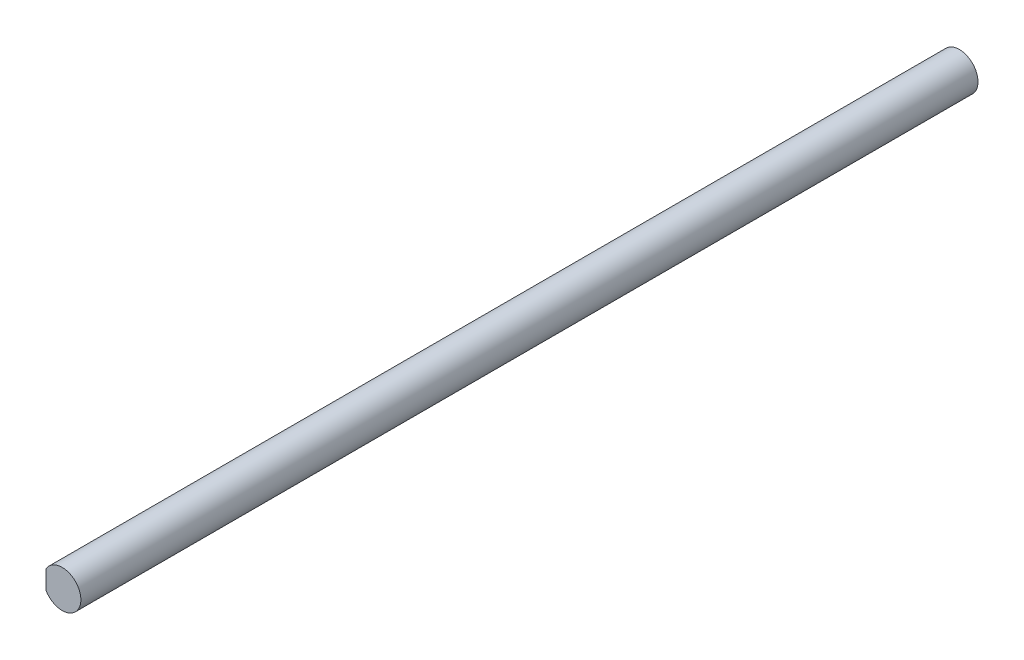
ISO-10303-21;
HEADER;
FILE_DESCRIPTION(('STEP AP214'),'2;1');
FILE_NAME('part.step','',(''),(''),'','','');
FILE_SCHEMA(('AUTOMOTIVE_DESIGN { 1 0 10303 214 1 1 1 1 }'));
ENDSEC;
DATA;
#1=APPLICATION_CONTEXT('core data for automotive mechanical design processes');
#2=APPLICATION_PROTOCOL_DEFINITION('international standard','automotive_design',2000,#1);
#3=PRODUCT_CONTEXT('',#1,'mechanical');
#4=PRODUCT('Part','Part','',(#3));
#5=PRODUCT_RELATED_PRODUCT_CATEGORY('part','',(#4));
#6=PRODUCT_DEFINITION_FORMATION('','',#4);
#7=PRODUCT_DEFINITION_CONTEXT('part definition',#1,'design');
#8=PRODUCT_DEFINITION('design','',#6,#7);
#9=PRODUCT_DEFINITION_SHAPE('','',#8);
#10=(LENGTH_UNIT() NAMED_UNIT(*) SI_UNIT(.MILLI.,.METRE.));
#11=(NAMED_UNIT(*) PLANE_ANGLE_UNIT() SI_UNIT($,.RADIAN.));
#12=(NAMED_UNIT(*) SI_UNIT($,.STERADIAN.) SOLID_ANGLE_UNIT());
#13=UNCERTAINTY_MEASURE_WITH_UNIT(LENGTH_MEASURE(1.E-05),#10,'distance_accuracy_value','');
#14=(GEOMETRIC_REPRESENTATION_CONTEXT(3) GLOBAL_UNCERTAINTY_ASSIGNED_CONTEXT((#13)) GLOBAL_UNIT_ASSIGNED_CONTEXT((#10,
#11,#12)) REPRESENTATION_CONTEXT('',''));
#15=CARTESIAN_POINT('',(0.,0.,0.));
#16=DIRECTION('',(0.,0.,1.));
#17=DIRECTION('',(1.,0.,0.));
#18=AXIS2_PLACEMENT_3D('',#15,#16,#17);
#19=CARTESIAN_POINT('',(0.,0.,152.4));
#20=DIRECTION('',(0.,0.,-1.));
#21=DIRECTION('',(-1.,0.,0.));
#22=AXIS2_PLACEMENT_3D('',#19,#20,#21);
#23=CYLINDRICAL_SURFACE('',#22,3.175);
#24=CARTESIAN_POINT('',(0.,0.,0.));
#25=DIRECTION('',(0.,0.,1.));
#26=DIRECTION('',(1.,0.,0.));
#27=AXIS2_PLACEMENT_3D('',#24,#25,#26);
#28=CIRCLE('',#27,3.175);
#29=CARTESIAN_POINT('',(-2.74963065701559,-1.5875,0.));
#30=VERTEX_POINT('',#29);
#31=CARTESIAN_POINT('',(-2.74963065701559,1.5875,0.));
#32=VERTEX_POINT('',#31);
#33=EDGE_CURVE('E72',#30,#32,#28,.T.);
#34=ORIENTED_EDGE('',*,*,#33,.T.);
#35=DIRECTION('',(0.,0.,-1.));
#36=VECTOR('',#35,1.);
#37=CARTESIAN_POINT('',(-2.74963065701559,1.5875,152.4));
#38=LINE('',#37,#36);
#39=CARTESIAN_POINT('',(-2.74963065701559,1.5875,152.4));
#40=VERTEX_POINT('',#39);
#41=EDGE_CURVE('E11',#40,#32,#38,.T.);
#42=ORIENTED_EDGE('',*,*,#41,.F.);
#43=CARTESIAN_POINT('',(0.,0.,152.4));
#44=DIRECTION('',(0.,0.,1.));
#45=DIRECTION('',(1.,0.,0.));
#46=AXIS2_PLACEMENT_3D('',#43,#44,#45);
#47=CIRCLE('',#46,3.175);
#48=CARTESIAN_POINT('',(-2.74963065701559,-1.5875,152.4));
#49=VERTEX_POINT('',#48);
#50=EDGE_CURVE('E71',#49,#40,#47,.T.);
#51=ORIENTED_EDGE('',*,*,#50,.F.);
#52=DIRECTION('',(0.,0.,-1.));
#53=VECTOR('',#52,1.);
#54=CARTESIAN_POINT('',(-2.74963065701559,-1.5875,152.4));
#55=LINE('',#54,#53);
#56=EDGE_CURVE('E48',#49,#30,#55,.T.);
#57=ORIENTED_EDGE('',*,*,#56,.T.);
#58=EDGE_LOOP('',(#34,#42,#51,#57));
#59=FACE_BOUND('',#58,.T.);
#60=ADVANCED_FACE('F39',(#59),#23,.T.);
#61=CARTESIAN_POINT('',(-2.74963065701559,1.5875,152.4));
#62=DIRECTION('',(1.,0.,0.));
#63=DIRECTION('',(0.,0.,-1.));
#64=AXIS2_PLACEMENT_3D('',#61,#62,#63);
#65=PLANE('',#64);
#66=DIRECTION('',(0.,-1.,0.));
#67=VECTOR('',#66,1.);
#68=CARTESIAN_POINT('',(-2.74963065701559,1.5875,0.));
#69=LINE('',#68,#67);
#70=EDGE_CURVE('E63',#32,#30,#69,.T.);
#71=ORIENTED_EDGE('',*,*,#70,.T.);
#72=ORIENTED_EDGE('',*,*,#56,.F.);
#73=DIRECTION('',(0.,-1.,0.));
#74=VECTOR('',#73,1.);
#75=CARTESIAN_POINT('',(-2.74963065701559,1.5875,152.4));
#76=LINE('',#75,#74);
#77=EDGE_CURVE('E55',#40,#49,#76,.T.);
#78=ORIENTED_EDGE('',*,*,#77,.F.);
#79=ORIENTED_EDGE('',*,*,#41,.T.);
#80=EDGE_LOOP('',(#71,#72,#78,#79));
#81=FACE_BOUND('',#80,.T.);
#82=ADVANCED_FACE('F66',(#81),#65,.F.);
#83=CARTESIAN_POINT('',(0.,0.,152.4));
#84=DIRECTION('',(0.,0.,1.));
#85=DIRECTION('',(1.,0.,0.));
#86=AXIS2_PLACEMENT_3D('',#83,#84,#85);
#87=PLANE('',#86);
#88=ORIENTED_EDGE('',*,*,#50,.T.);
#89=ORIENTED_EDGE('',*,*,#77,.T.);
#90=EDGE_LOOP('',(#88,#89));
#91=FACE_BOUND('',#90,.T.);
#92=ADVANCED_FACE('F83',(#91),#87,.T.);
#93=CARTESIAN_POINT('',(0.,0.,0.));
#94=DIRECTION('',(0.,0.,1.));
#95=DIRECTION('',(1.,0.,0.));
#96=AXIS2_PLACEMENT_3D('',#93,#94,#95);
#97=PLANE('',#96);
#98=ORIENTED_EDGE('',*,*,#33,.F.);
#99=ORIENTED_EDGE('',*,*,#70,.F.);
#100=EDGE_LOOP('',(#98,#99));
#101=FACE_BOUND('',#100,.T.);
#102=ADVANCED_FACE('F76',(#101),#97,.F.);
#103=CLOSED_SHELL('',(#60,#82,#92,#102));
#104=MANIFOLD_SOLID_BREP('B2',#103);
#105=ADVANCED_BREP_SHAPE_REPRESENTATION('',(#18,#104),#14);
#106=SHAPE_DEFINITION_REPRESENTATION(#9,#105);
ENDSEC;
END-ISO-10303-21;
